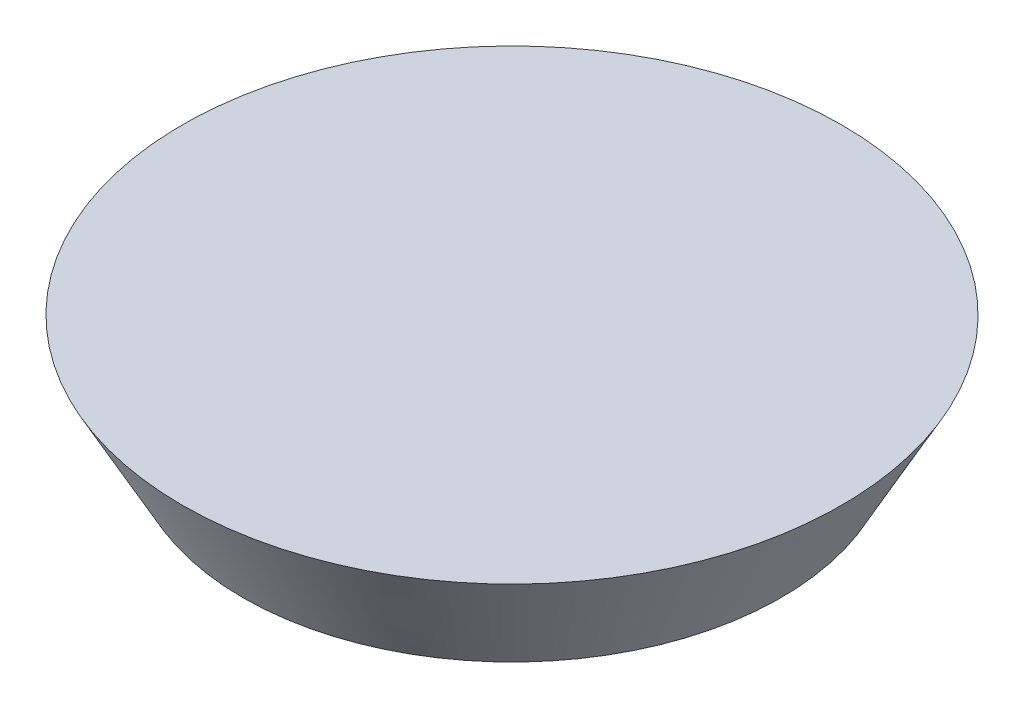
ISO-10303-21;
HEADER;
FILE_DESCRIPTION(('STEP AP214'),'2;1');
FILE_NAME('part.step','',(''),(''),'','','');
FILE_SCHEMA(('AUTOMOTIVE_DESIGN { 1 0 10303 214 1 1 1 1 }'));
ENDSEC;
DATA;
#1=APPLICATION_CONTEXT('core data for automotive mechanical design processes');
#2=APPLICATION_PROTOCOL_DEFINITION('international standard','automotive_design',2000,#1);
#3=PRODUCT_CONTEXT('',#1,'mechanical');
#4=PRODUCT('Part','Part','',(#3));
#5=PRODUCT_RELATED_PRODUCT_CATEGORY('part','',(#4));
#6=PRODUCT_DEFINITION_FORMATION('','',#4);
#7=PRODUCT_DEFINITION_CONTEXT('part definition',#1,'design');
#8=PRODUCT_DEFINITION('design','',#6,#7);
#9=PRODUCT_DEFINITION_SHAPE('','',#8);
#10=(LENGTH_UNIT() NAMED_UNIT(*) SI_UNIT(.MILLI.,.METRE.));
#11=(NAMED_UNIT(*) PLANE_ANGLE_UNIT() SI_UNIT($,.RADIAN.));
#12=(NAMED_UNIT(*) SI_UNIT($,.STERADIAN.) SOLID_ANGLE_UNIT());
#13=UNCERTAINTY_MEASURE_WITH_UNIT(LENGTH_MEASURE(1.E-05),#10,'distance_accuracy_value','');
#14=(GEOMETRIC_REPRESENTATION_CONTEXT(3) GLOBAL_UNCERTAINTY_ASSIGNED_CONTEXT((#13)) GLOBAL_UNIT_ASSIGNED_CONTEXT((#10,
#11,#12)) REPRESENTATION_CONTEXT('',''));
#15=CARTESIAN_POINT('',(0.,0.,0.));
#16=DIRECTION('',(0.,0.,1.));
#17=DIRECTION('',(1.,0.,0.));
#18=AXIS2_PLACEMENT_3D('',#15,#16,#17);
#19=CARTESIAN_POINT('',(0.,0.,0.));
#20=DIRECTION('',(0.,-1.,0.));
#21=DIRECTION('',(0.,0.,-1.));
#22=AXIS2_PLACEMENT_3D('',#19,#20,#21);
#23=PLANE('',#22);
#24=CARTESIAN_POINT('',(0.,0.,0.));
#25=DIRECTION('',(0.,1.,0.));
#26=DIRECTION('',(0.,0.,1.));
#27=AXIS2_PLACEMENT_3D('',#24,#25,#26);
#28=CIRCLE('',#27,10.);
#29=CARTESIAN_POINT('',(0.,0.,10.));
#30=VERTEX_POINT('',#29);
#31=EDGE_CURVE('E10',#30,#30,#28,.T.);
#32=ORIENTED_EDGE('',*,*,#31,.F.);
#33=EDGE_LOOP('',(#32));
#34=FACE_BOUND('',#33,.T.);
#35=ADVANCED_FACE('F31',(#34),#23,.T.);
#36=CARTESIAN_POINT('',(0.,4.1,0.));
#37=DIRECTION('',(0.,1.,0.));
#38=DIRECTION('',(0.,0.,1.));
#39=AXIS2_PLACEMENT_3D('',#36,#37,#38);
#40=CONICAL_SURFACE('',#39,12.25,0.501906443051994);
#41=ORIENTED_EDGE('',*,*,#31,.T.);
#42=EDGE_LOOP('',(#41));
#43=FACE_BOUND('',#42,.T.);
#44=CARTESIAN_POINT('',(0.,4.1,0.));
#45=DIRECTION('',(0.,1.,0.));
#46=DIRECTION('',(0.,0.,1.));
#47=AXIS2_PLACEMENT_3D('',#44,#45,#46);
#48=CIRCLE('',#47,12.25);
#49=CARTESIAN_POINT('',(0.,4.1,12.25));
#50=VERTEX_POINT('',#49);
#51=EDGE_CURVE('E37',#50,#50,#48,.T.);
#52=ORIENTED_EDGE('',*,*,#51,.F.);
#53=EDGE_LOOP('',(#52));
#54=FACE_BOUND('',#53,.T.);
#55=ADVANCED_FACE('F45',(#43,#54),#40,.T.);
#56=CARTESIAN_POINT('',(-12.25,4.1,0.));
#57=DIRECTION('',(0.,1.,0.));
#58=DIRECTION('',(0.,0.,1.));
#59=AXIS2_PLACEMENT_3D('',#56,#57,#58);
#60=PLANE('',#59);
#61=ORIENTED_EDGE('',*,*,#51,.T.);
#62=EDGE_LOOP('',(#61));
#63=FACE_BOUND('',#62,.T.);
#64=ADVANCED_FACE('F43',(#63),#60,.T.);
#65=CLOSED_SHELL('',(#35,#55,#64));
#66=MANIFOLD_SOLID_BREP('B2',#65);
#67=ADVANCED_BREP_SHAPE_REPRESENTATION('',(#18,#66),#14);
#68=SHAPE_DEFINITION_REPRESENTATION(#9,#67);
ENDSEC;
END-ISO-10303-21;
